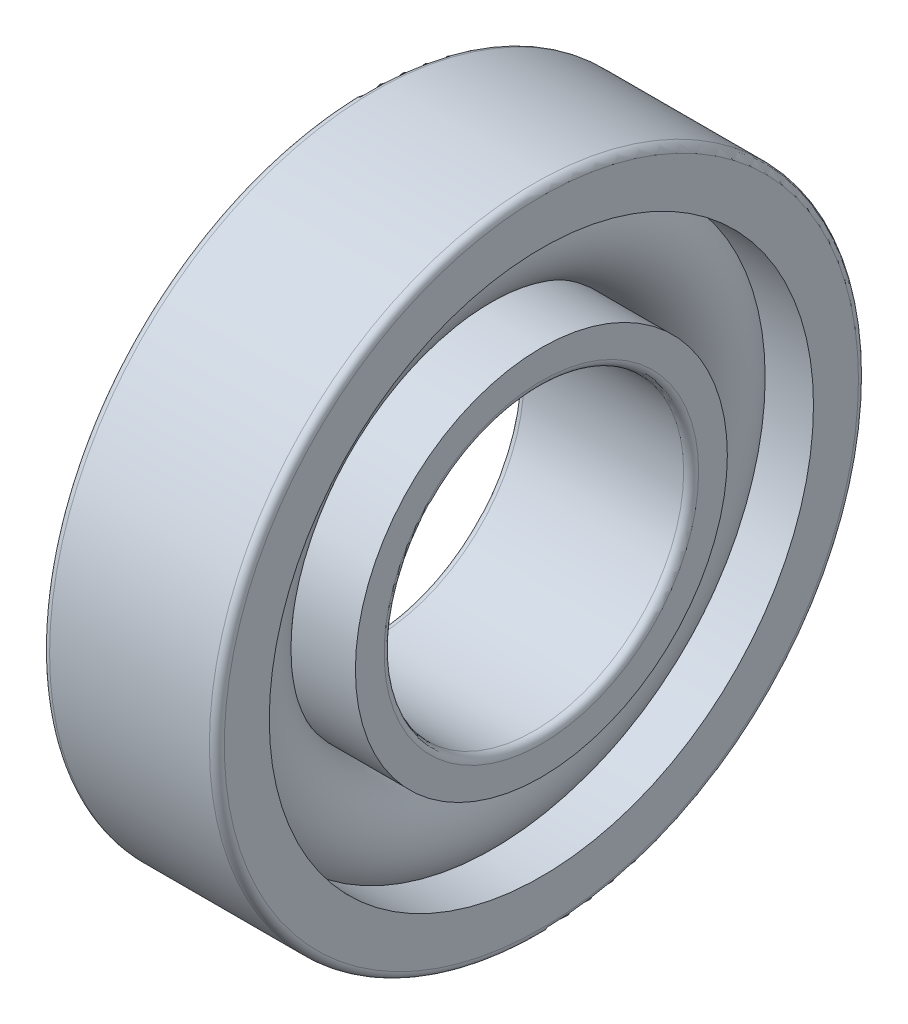
ISO-10303-21;
HEADER;
FILE_DESCRIPTION(('STEP AP214'),'2;1');
FILE_NAME('part.step','',(''),(''),'','','');
FILE_SCHEMA(('AUTOMOTIVE_DESIGN { 1 0 10303 214 1 1 1 1 }'));
ENDSEC;
DATA;
#1=APPLICATION_CONTEXT('core data for automotive mechanical design processes');
#2=APPLICATION_PROTOCOL_DEFINITION('international standard','automotive_design',2000,#1);
#3=PRODUCT_CONTEXT('',#1,'mechanical');
#4=PRODUCT('Part','Part','',(#3));
#5=PRODUCT_RELATED_PRODUCT_CATEGORY('part','',(#4));
#6=PRODUCT_DEFINITION_FORMATION('','',#4);
#7=PRODUCT_DEFINITION_CONTEXT('part definition',#1,'design');
#8=PRODUCT_DEFINITION('design','',#6,#7);
#9=PRODUCT_DEFINITION_SHAPE('','',#8);
#10=(LENGTH_UNIT() NAMED_UNIT(*) SI_UNIT(.MILLI.,.METRE.));
#11=(NAMED_UNIT(*) PLANE_ANGLE_UNIT() SI_UNIT($,.RADIAN.));
#12=(NAMED_UNIT(*) SI_UNIT($,.STERADIAN.) SOLID_ANGLE_UNIT());
#13=UNCERTAINTY_MEASURE_WITH_UNIT(LENGTH_MEASURE(1.E-05),#10,'distance_accuracy_value','');
#14=(GEOMETRIC_REPRESENTATION_CONTEXT(3) GLOBAL_UNCERTAINTY_ASSIGNED_CONTEXT((#13)) GLOBAL_UNIT_ASSIGNED_CONTEXT((#10,
#11,#12)) REPRESENTATION_CONTEXT('',''));
#15=CARTESIAN_POINT('',(0.,0.,0.));
#16=DIRECTION('',(0.,0.,1.));
#17=DIRECTION('',(1.,0.,0.));
#18=AXIS2_PLACEMENT_3D('',#15,#16,#17);
#19=CARTESIAN_POINT('',(0.,0.,0.));
#20=DIRECTION('',(-1.,0.,0.));
#21=DIRECTION('',(0.,0.,1.));
#22=AXIS2_PLACEMENT_3D('',#19,#20,#21);
#23=TOROIDAL_SURFACE('',#22,4.75,1.05);
#24=CARTESIAN_POINT('',(0.782623792124928,0.,0.));
#25=DIRECTION('',(-1.,0.,0.));
#26=DIRECTION('',(0.,0.,1.));
#27=AXIS2_PLACEMENT_3D('',#24,#25,#26);
#28=CIRCLE('',#27,5.45);
#29=CARTESIAN_POINT('',(0.782623792124928,0.,5.45));
#30=VERTEX_POINT('',#29);
#31=EDGE_CURVE('E41',#30,#30,#28,.F.);
#32=ORIENTED_EDGE('',*,*,#31,.T.);
#33=EDGE_LOOP('',(#32));
#34=FACE_BOUND('',#33,.T.);
#35=CARTESIAN_POINT('',(0.227760839478604,0.,0.));
#36=DIRECTION('',(-1.,0.,0.));
#37=DIRECTION('',(0.,0.,1.));
#38=AXIS2_PLACEMENT_3D('',#35,#36,#37);
#39=CIRCLE('',#38,3.725);
#40=CARTESIAN_POINT('',(0.227760839478604,0.,3.725));
#41=VERTEX_POINT('',#40);
#42=EDGE_CURVE('E10',#41,#41,#39,.T.);
#43=ORIENTED_EDGE('',*,*,#42,.T.);
#44=EDGE_LOOP('',(#43));
#45=FACE_BOUND('',#44,.T.);
#46=ADVANCED_FACE('F40',(#34,#45),#23,.T.);
#47=CARTESIAN_POINT('',(-20.6375,0.,0.));
#48=DIRECTION('',(1.,0.,0.));
#49=DIRECTION('',(0.,0.,-1.));
#50=AXIS2_PLACEMENT_3D('',#47,#48,#49);
#51=CYLINDRICAL_SURFACE('',#50,3.725);
#52=CARTESIAN_POINT('',(1.75,0.,0.));
#53=DIRECTION('',(1.,0.,0.));
#54=DIRECTION('',(0.,0.,-1.));
#55=AXIS2_PLACEMENT_3D('',#52,#53,#54);
#56=CIRCLE('',#55,3.725);
#57=CARTESIAN_POINT('',(1.75,0.,-3.725));
#58=VERTEX_POINT('',#57);
#59=EDGE_CURVE('E49',#58,#58,#56,.T.);
#60=ORIENTED_EDGE('',*,*,#59,.F.);
#61=EDGE_LOOP('',(#60));
#62=FACE_BOUND('',#61,.T.);
#63=ORIENTED_EDGE('',*,*,#42,.F.);
#64=EDGE_LOOP('',(#63));
#65=FACE_BOUND('',#64,.T.);
#66=ADVANCED_FACE('F88',(#62,#65),#51,.T.);
#67=CARTESIAN_POINT('',(-20.6375,0.,0.));
#68=DIRECTION('',(1.,0.,0.));
#69=DIRECTION('',(0.,0.,-1.));
#70=AXIS2_PLACEMENT_3D('',#67,#68,#69);
#71=CYLINDRICAL_SURFACE('',#70,4.05);
#72=CARTESIAN_POINT('',(-1.75,0.,0.));
#73=DIRECTION('',(1.,0.,0.));
#74=DIRECTION('',(0.,0.,-1.));
#75=AXIS2_PLACEMENT_3D('',#72,#73,#74);
#76=CIRCLE('',#75,4.05);
#77=CARTESIAN_POINT('',(-1.75,0.,-4.05));
#78=VERTEX_POINT('',#77);
#79=EDGE_CURVE('E56',#78,#78,#76,.T.);
#80=ORIENTED_EDGE('',*,*,#79,.T.);
#81=EDGE_LOOP('',(#80));
#82=FACE_BOUND('',#81,.T.);
#83=CARTESIAN_POINT('',(-0.782623792124926,0.,0.));
#84=DIRECTION('',(1.,0.,0.));
#85=DIRECTION('',(0.,0.,-1.));
#86=AXIS2_PLACEMENT_3D('',#83,#84,#85);
#87=CIRCLE('',#86,4.05);
#88=CARTESIAN_POINT('',(-0.782623792124926,0.,-4.05));
#89=VERTEX_POINT('',#88);
#90=EDGE_CURVE('E44',#89,#89,#87,.T.);
#91=ORIENTED_EDGE('',*,*,#90,.F.);
#92=EDGE_LOOP('',(#91));
#93=FACE_BOUND('',#92,.T.);
#94=ADVANCED_FACE('F95',(#82,#93),#71,.T.);
#95=CARTESIAN_POINT('',(1.75,3.15,0.));
#96=DIRECTION('',(1.,0.,0.));
#97=DIRECTION('',(0.,0.,-1.));
#98=AXIS2_PLACEMENT_3D('',#95,#96,#97);
#99=PLANE('',#98);
#100=ORIENTED_EDGE('',*,*,#59,.T.);
#101=EDGE_LOOP('',(#100));
#102=FACE_BOUND('',#101,.T.);
#103=CARTESIAN_POINT('',(1.75,0.,0.));
#104=DIRECTION('',(1.,0.,0.));
#105=DIRECTION('',(0.,0.,-1.));
#106=AXIS2_PLACEMENT_3D('',#103,#104,#105);
#107=CIRCLE('',#106,3.15);
#108=CARTESIAN_POINT('',(1.75,0.,-3.15));
#109=VERTEX_POINT('',#108);
#110=EDGE_CURVE('E83',#109,#109,#107,.T.);
#111=ORIENTED_EDGE('',*,*,#110,.F.);
#112=EDGE_LOOP('',(#111));
#113=FACE_BOUND('',#112,.T.);
#114=ADVANCED_FACE('F89',(#102,#113),#99,.T.);
#115=CARTESIAN_POINT('',(1.6,0.,0.));
#116=DIRECTION('',(1.,0.,0.));
#117=DIRECTION('',(0.,0.,-1.));
#118=AXIS2_PLACEMENT_3D('',#115,#116,#117);
#119=TOROIDAL_SURFACE('',#118,3.15,0.15);
#120=ORIENTED_EDGE('',*,*,#110,.T.);
#121=EDGE_LOOP('',(#120));
#122=FACE_BOUND('',#121,.T.);
#123=CARTESIAN_POINT('',(1.6,0.,0.));
#124=DIRECTION('',(1.,0.,0.));
#125=DIRECTION('',(0.,0.,-1.));
#126=AXIS2_PLACEMENT_3D('',#123,#124,#125);
#127=CIRCLE('',#126,3.);
#128=CARTESIAN_POINT('',(1.6,0.,-3.));
#129=VERTEX_POINT('',#128);
#130=EDGE_CURVE('E76',#129,#129,#127,.T.);
#131=ORIENTED_EDGE('',*,*,#130,.F.);
#132=EDGE_LOOP('',(#131));
#133=FACE_BOUND('',#132,.T.);
#134=ADVANCED_FACE('F101',(#122,#133),#119,.T.);
#135=CARTESIAN_POINT('',(-20.6375,0.,0.));
#136=DIRECTION('',(1.,0.,0.));
#137=DIRECTION('',(0.,0.,-1.));
#138=AXIS2_PLACEMENT_3D('',#135,#136,#137);
#139=CYLINDRICAL_SURFACE('',#138,3.);
#140=ORIENTED_EDGE('',*,*,#130,.T.);
#141=EDGE_LOOP('',(#140));
#142=FACE_BOUND('',#141,.T.);
#143=CARTESIAN_POINT('',(-1.6,0.,0.));
#144=DIRECTION('',(1.,0.,0.));
#145=DIRECTION('',(0.,0.,-1.));
#146=AXIS2_PLACEMENT_3D('',#143,#144,#145);
#147=CIRCLE('',#146,3.);
#148=CARTESIAN_POINT('',(-1.6,0.,-3.));
#149=VERTEX_POINT('',#148);
#150=EDGE_CURVE('E74',#149,#149,#147,.T.);
#151=ORIENTED_EDGE('',*,*,#150,.F.);
#152=EDGE_LOOP('',(#151));
#153=FACE_BOUND('',#152,.T.);
#154=ADVANCED_FACE('F106',(#142,#153),#139,.F.);
#155=CARTESIAN_POINT('',(-1.6,0.,0.));
#156=DIRECTION('',(1.,0.,0.));
#157=DIRECTION('',(0.,0.,-1.));
#158=AXIS2_PLACEMENT_3D('',#155,#156,#157);
#159=TOROIDAL_SURFACE('',#158,3.15,0.15);
#160=ORIENTED_EDGE('',*,*,#150,.T.);
#161=EDGE_LOOP('',(#160));
#162=FACE_BOUND('',#161,.T.);
#163=CARTESIAN_POINT('',(-1.75,0.,0.));
#164=DIRECTION('',(1.,0.,0.));
#165=DIRECTION('',(0.,0.,-1.));
#166=AXIS2_PLACEMENT_3D('',#163,#164,#165);
#167=CIRCLE('',#166,3.15);
#168=CARTESIAN_POINT('',(-1.75,0.,-3.15));
#169=VERTEX_POINT('',#168);
#170=EDGE_CURVE('E75',#169,#169,#167,.T.);
#171=ORIENTED_EDGE('',*,*,#170,.F.);
#172=EDGE_LOOP('',(#171));
#173=FACE_BOUND('',#172,.T.);
#174=ADVANCED_FACE('F109',(#162,#173),#159,.T.);
#175=CARTESIAN_POINT('',(-1.75,4.05,0.));
#176=DIRECTION('',(-1.,0.,0.));
#177=DIRECTION('',(0.,0.,1.));
#178=AXIS2_PLACEMENT_3D('',#175,#176,#177);
#179=PLANE('',#178);
#180=ORIENTED_EDGE('',*,*,#170,.T.);
#181=EDGE_LOOP('',(#180));
#182=FACE_BOUND('',#181,.T.);
#183=ORIENTED_EDGE('',*,*,#79,.F.);
#184=EDGE_LOOP('',(#183));
#185=FACE_BOUND('',#184,.T.);
#186=ADVANCED_FACE('F112',(#182,#185),#179,.T.);
#187=CARTESIAN_POINT('',(-0.227760839478604,0.,0.));
#188=DIRECTION('',(1.,0.,0.));
#189=DIRECTION('',(0.,0.,-1.));
#190=AXIS2_PLACEMENT_3D('',#187,#188,#189);
#191=CIRCLE('',#190,5.775);
#192=CARTESIAN_POINT('',(-0.227760839478604,0.,-5.775));
#193=VERTEX_POINT('',#192);
#194=EDGE_CURVE('E52',#193,#193,#191,.F.);
#195=ORIENTED_EDGE('',*,*,#194,.T.);
#196=EDGE_LOOP('',(#195));
#197=FACE_BOUND('',#196,.T.);
#198=ORIENTED_EDGE('',*,*,#90,.T.);
#199=EDGE_LOOP('',(#198));
#200=FACE_BOUND('',#199,.T.);
#201=ADVANCED_FACE('F39',(#197,#200),#23,.T.);
#202=CARTESIAN_POINT('',(-20.6375,0.,0.));
#203=DIRECTION('',(1.,0.,0.));
#204=DIRECTION('',(0.,0.,-1.));
#205=AXIS2_PLACEMENT_3D('',#202,#203,#204);
#206=CYLINDRICAL_SURFACE('',#205,5.45);
#207=CARTESIAN_POINT('',(1.75,0.,0.));
#208=DIRECTION('',(1.,0.,0.));
#209=DIRECTION('',(0.,0.,-1.));
#210=AXIS2_PLACEMENT_3D('',#207,#208,#209);
#211=CIRCLE('',#210,5.45);
#212=CARTESIAN_POINT('',(1.75,0.,-5.45));
#213=VERTEX_POINT('',#212);
#214=EDGE_CURVE('E152',#213,#213,#211,.T.);
#215=ORIENTED_EDGE('',*,*,#214,.T.);
#216=EDGE_LOOP('',(#215));
#217=FACE_BOUND('',#216,.T.);
#218=ORIENTED_EDGE('',*,*,#31,.F.);
#219=EDGE_LOOP('',(#218));
#220=FACE_BOUND('',#219,.T.);
#221=ADVANCED_FACE('F138',(#217,#220),#206,.F.);
#222=CARTESIAN_POINT('',(-20.6375,0.,0.));
#223=DIRECTION('',(1.,0.,0.));
#224=DIRECTION('',(0.,0.,-1.));
#225=AXIS2_PLACEMENT_3D('',#222,#223,#224);
#226=CYLINDRICAL_SURFACE('',#225,5.775);
#227=CARTESIAN_POINT('',(-1.75,0.,0.));
#228=DIRECTION('',(1.,0.,0.));
#229=DIRECTION('',(0.,0.,-1.));
#230=AXIS2_PLACEMENT_3D('',#227,#228,#229);
#231=CIRCLE('',#230,5.775);
#232=CARTESIAN_POINT('',(-1.75,0.,-5.775));
#233=VERTEX_POINT('',#232);
#234=EDGE_CURVE('E149',#233,#233,#231,.T.);
#235=ORIENTED_EDGE('',*,*,#234,.F.);
#236=EDGE_LOOP('',(#235));
#237=FACE_BOUND('',#236,.T.);
#238=ORIENTED_EDGE('',*,*,#194,.F.);
#239=EDGE_LOOP('',(#238));
#240=FACE_BOUND('',#239,.T.);
#241=ADVANCED_FACE('F124',(#237,#240),#226,.F.);
#242=CARTESIAN_POINT('',(-1.6,0.,0.));
#243=DIRECTION('',(1.,0.,0.));
#244=DIRECTION('',(0.,0.,-1.));
#245=AXIS2_PLACEMENT_3D('',#242,#243,#244);
#246=TOROIDAL_SURFACE('',#245,6.35,0.150000000000001);
#247=CARTESIAN_POINT('',(-1.75,0.,0.));
#248=DIRECTION('',(1.,0.,0.));
#249=DIRECTION('',(0.,0.,-1.));
#250=AXIS2_PLACEMENT_3D('',#247,#248,#249);
#251=CIRCLE('',#250,6.35);
#252=CARTESIAN_POINT('',(-1.75,0.,-6.35));
#253=VERTEX_POINT('',#252);
#254=EDGE_CURVE('E155',#253,#253,#251,.T.);
#255=ORIENTED_EDGE('',*,*,#254,.T.);
#256=EDGE_LOOP('',(#255));
#257=FACE_BOUND('',#256,.T.);
#258=CARTESIAN_POINT('',(-1.6,0.,0.));
#259=DIRECTION('',(1.,0.,0.));
#260=DIRECTION('',(0.,0.,-1.));
#261=AXIS2_PLACEMENT_3D('',#258,#259,#260);
#262=CIRCLE('',#261,6.5);
#263=CARTESIAN_POINT('',(-1.6,0.,-6.5));
#264=VERTEX_POINT('',#263);
#265=EDGE_CURVE('E54',#264,#264,#262,.T.);
#266=ORIENTED_EDGE('',*,*,#265,.F.);
#267=EDGE_LOOP('',(#266));
#268=FACE_BOUND('',#267,.T.);
#269=ADVANCED_FACE('F118',(#257,#268),#246,.T.);
#270=CARTESIAN_POINT('',(-20.6375,0.,0.));
#271=DIRECTION('',(1.,0.,0.));
#272=DIRECTION('',(0.,0.,-1.));
#273=AXIS2_PLACEMENT_3D('',#270,#271,#272);
#274=CYLINDRICAL_SURFACE('',#273,6.5);
#275=ORIENTED_EDGE('',*,*,#265,.T.);
#276=EDGE_LOOP('',(#275));
#277=FACE_BOUND('',#276,.T.);
#278=CARTESIAN_POINT('',(1.6,0.,0.));
#279=DIRECTION('',(1.,0.,0.));
#280=DIRECTION('',(0.,0.,-1.));
#281=AXIS2_PLACEMENT_3D('',#278,#279,#280);
#282=CIRCLE('',#281,6.5);
#283=CARTESIAN_POINT('',(1.6,0.,-6.5));
#284=VERTEX_POINT('',#283);
#285=EDGE_CURVE('E63',#284,#284,#282,.T.);
#286=ORIENTED_EDGE('',*,*,#285,.F.);
#287=EDGE_LOOP('',(#286));
#288=FACE_BOUND('',#287,.T.);
#289=ADVANCED_FACE('F125',(#277,#288),#274,.T.);
#290=CARTESIAN_POINT('',(1.6,0.,0.));
#291=DIRECTION('',(1.,0.,0.));
#292=DIRECTION('',(0.,0.,-1.));
#293=AXIS2_PLACEMENT_3D('',#290,#291,#292);
#294=TOROIDAL_SURFACE('',#293,6.35,0.150000000000001);
#295=ORIENTED_EDGE('',*,*,#285,.T.);
#296=EDGE_LOOP('',(#295));
#297=FACE_BOUND('',#296,.T.);
#298=CARTESIAN_POINT('',(1.75,0.,0.));
#299=DIRECTION('',(1.,0.,0.));
#300=DIRECTION('',(0.,0.,-1.));
#301=AXIS2_PLACEMENT_3D('',#298,#299,#300);
#302=CIRCLE('',#301,6.35);
#303=CARTESIAN_POINT('',(1.75,0.,-6.35));
#304=VERTEX_POINT('',#303);
#305=EDGE_CURVE('E69',#304,#304,#302,.T.);
#306=ORIENTED_EDGE('',*,*,#305,.F.);
#307=EDGE_LOOP('',(#306));
#308=FACE_BOUND('',#307,.T.);
#309=ADVANCED_FACE('F130',(#297,#308),#294,.T.);
#310=CARTESIAN_POINT('',(1.75,6.35,0.));
#311=DIRECTION('',(1.,0.,0.));
#312=DIRECTION('',(0.,0.,-1.));
#313=AXIS2_PLACEMENT_3D('',#310,#311,#312);
#314=PLANE('',#313);
#315=ORIENTED_EDGE('',*,*,#305,.T.);
#316=EDGE_LOOP('',(#315));
#317=FACE_BOUND('',#316,.T.);
#318=ORIENTED_EDGE('',*,*,#214,.F.);
#319=EDGE_LOOP('',(#318));
#320=FACE_BOUND('',#319,.T.);
#321=ADVANCED_FACE('F129',(#317,#320),#314,.T.);
#322=CARTESIAN_POINT('',(-1.75,5.775,0.));
#323=DIRECTION('',(-1.,0.,0.));
#324=DIRECTION('',(0.,0.,1.));
#325=AXIS2_PLACEMENT_3D('',#322,#323,#324);
#326=PLANE('',#325);
#327=ORIENTED_EDGE('',*,*,#234,.T.);
#328=EDGE_LOOP('',(#327));
#329=FACE_BOUND('',#328,.T.);
#330=ORIENTED_EDGE('',*,*,#254,.F.);
#331=EDGE_LOOP('',(#330));
#332=FACE_BOUND('',#331,.T.);
#333=ADVANCED_FACE('F133',(#329,#332),#326,.T.);
#334=CLOSED_SHELL('',(#46,#66,#94,#114,#134,#154,#174,#186,#201,#221,#241,#269,#289,#309,#321,#333));
#335=MANIFOLD_SOLID_BREP('B2',#334);
#336=ADVANCED_BREP_SHAPE_REPRESENTATION('',(#18,#335),#14);
#337=SHAPE_DEFINITION_REPRESENTATION(#9,#336);
ENDSEC;
END-ISO-10303-21;
